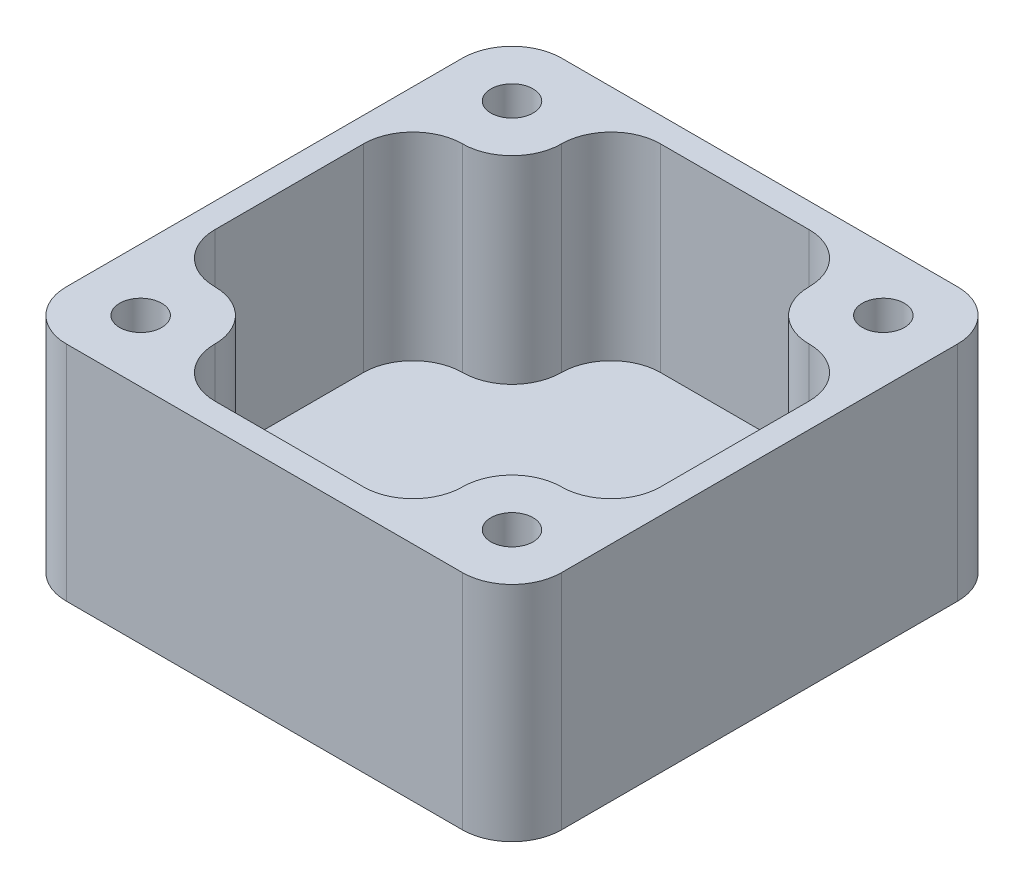
ISO-10303-21;
HEADER;
FILE_DESCRIPTION(('STEP AP214'),'2;1');
FILE_NAME('part.step','',(''),(''),'','','');
FILE_SCHEMA(('AUTOMOTIVE_DESIGN { 1 0 10303 214 1 1 1 1 }'));
ENDSEC;
DATA;
#1=APPLICATION_CONTEXT('core data for automotive mechanical design processes');
#2=APPLICATION_PROTOCOL_DEFINITION('international standard','automotive_design',2000,#1);
#3=PRODUCT_CONTEXT('',#1,'mechanical');
#4=PRODUCT('Part','Part','',(#3));
#5=PRODUCT_RELATED_PRODUCT_CATEGORY('part','',(#4));
#6=PRODUCT_DEFINITION_FORMATION('','',#4);
#7=PRODUCT_DEFINITION_CONTEXT('part definition',#1,'design');
#8=PRODUCT_DEFINITION('design','',#6,#7);
#9=PRODUCT_DEFINITION_SHAPE('','',#8);
#10=(LENGTH_UNIT() NAMED_UNIT(*) SI_UNIT(.MILLI.,.METRE.));
#11=(NAMED_UNIT(*) PLANE_ANGLE_UNIT() SI_UNIT($,.RADIAN.));
#12=(NAMED_UNIT(*) SI_UNIT($,.STERADIAN.) SOLID_ANGLE_UNIT());
#13=UNCERTAINTY_MEASURE_WITH_UNIT(LENGTH_MEASURE(1.E-05),#10,'distance_accuracy_value','');
#14=(GEOMETRIC_REPRESENTATION_CONTEXT(3) GLOBAL_UNCERTAINTY_ASSIGNED_CONTEXT((#13)) GLOBAL_UNIT_ASSIGNED_CONTEXT((#10,
#11,#12)) REPRESENTATION_CONTEXT('',''));
#15=CARTESIAN_POINT('',(0.,0.,0.));
#16=DIRECTION('',(0.,0.,1.));
#17=DIRECTION('',(1.,0.,0.));
#18=AXIS2_PLACEMENT_3D('',#15,#16,#17);
#19=CARTESIAN_POINT('',(-20.,18.,-20.));
#20=DIRECTION('',(1.,0.,0.));
#21=DIRECTION('',(0.,0.,-1.));
#22=AXIS2_PLACEMENT_3D('',#19,#20,#21);
#23=PLANE('',#22);
#24=DIRECTION('',(0.,0.,1.));
#25=VECTOR('',#24,1.);
#26=CARTESIAN_POINT('',(-20.,18.,-20.));
#27=LINE('',#26,#25);
#28=CARTESIAN_POINT('',(-20.,18.,-16.));
#29=VERTEX_POINT('',#28);
#30=CARTESIAN_POINT('',(-20.,18.,16.));
#31=VERTEX_POINT('',#30);
#32=EDGE_CURVE('E225',#29,#31,#27,.T.);
#33=ORIENTED_EDGE('',*,*,#32,.F.);
#34=DIRECTION('',(0.,-1.,0.));
#35=VECTOR('',#34,1.);
#36=CARTESIAN_POINT('',(-20.,18.,-16.));
#37=LINE('',#36,#35);
#38=CARTESIAN_POINT('',(-20.,0.,-16.));
#39=VERTEX_POINT('',#38);
#40=EDGE_CURVE('E261',#29,#39,#37,.T.);
#41=ORIENTED_EDGE('',*,*,#40,.T.);
#42=DIRECTION('',(0.,0.,1.));
#43=VECTOR('',#42,1.);
#44=CARTESIAN_POINT('',(-20.,0.,-20.));
#45=LINE('',#44,#43);
#46=CARTESIAN_POINT('',(-20.,0.,16.));
#47=VERTEX_POINT('',#46);
#48=EDGE_CURVE('E409',#39,#47,#45,.T.);
#49=ORIENTED_EDGE('',*,*,#48,.T.);
#50=DIRECTION('',(0.,-1.,0.));
#51=VECTOR('',#50,1.);
#52=CARTESIAN_POINT('',(-20.,18.,16.));
#53=LINE('',#52,#51);
#54=EDGE_CURVE('E259',#47,#31,#53,.F.);
#55=ORIENTED_EDGE('',*,*,#54,.T.);
#56=EDGE_LOOP('',(#33,#41,#49,#55));
#57=FACE_BOUND('',#56,.T.);
#58=ADVANCED_FACE('F36',(#57),#23,.F.);
#59=CARTESIAN_POINT('',(20.,18.,20.));
#60=DIRECTION('',(0.,0.,-1.));
#61=DIRECTION('',(-1.,0.,0.));
#62=AXIS2_PLACEMENT_3D('',#59,#60,#61);
#63=PLANE('',#62);
#64=DIRECTION('',(1.,0.,0.));
#65=VECTOR('',#64,1.);
#66=CARTESIAN_POINT('',(20.,18.,20.));
#67=LINE('',#66,#65);
#68=CARTESIAN_POINT('',(-16.,18.,20.));
#69=VERTEX_POINT('',#68);
#70=CARTESIAN_POINT('',(16.,18.,20.));
#71=VERTEX_POINT('',#70);
#72=EDGE_CURVE('E229',#69,#71,#67,.T.);
#73=ORIENTED_EDGE('',*,*,#72,.F.);
#74=DIRECTION('',(0.,-1.,0.));
#75=VECTOR('',#74,1.);
#76=CARTESIAN_POINT('',(-16.,18.,20.));
#77=LINE('',#76,#75);
#78=CARTESIAN_POINT('',(-16.,0.,20.));
#79=VERTEX_POINT('',#78);
#80=EDGE_CURVE('E266',#69,#79,#77,.T.);
#81=ORIENTED_EDGE('',*,*,#80,.T.);
#82=DIRECTION('',(1.,0.,0.));
#83=VECTOR('',#82,1.);
#84=CARTESIAN_POINT('',(20.,0.,20.));
#85=LINE('',#84,#83);
#86=CARTESIAN_POINT('',(16.,0.,20.));
#87=VERTEX_POINT('',#86);
#88=EDGE_CURVE('E231',#79,#87,#85,.T.);
#89=ORIENTED_EDGE('',*,*,#88,.T.);
#90=DIRECTION('',(0.,-1.,0.));
#91=VECTOR('',#90,1.);
#92=CARTESIAN_POINT('',(16.,18.,20.));
#93=LINE('',#92,#91);
#94=EDGE_CURVE('E264',#87,#71,#93,.F.);
#95=ORIENTED_EDGE('',*,*,#94,.T.);
#96=EDGE_LOOP('',(#73,#81,#89,#95));
#97=FACE_BOUND('',#96,.T.);
#98=ADVANCED_FACE('F424',(#97),#63,.F.);
#99=CARTESIAN_POINT('',(20.,18.,-20.));
#100=DIRECTION('',(-1.,0.,0.));
#101=DIRECTION('',(0.,0.,1.));
#102=AXIS2_PLACEMENT_3D('',#99,#100,#101);
#103=PLANE('',#102);
#104=DIRECTION('',(0.,0.,-1.));
#105=VECTOR('',#104,1.);
#106=CARTESIAN_POINT('',(20.,0.,-20.));
#107=LINE('',#106,#105);
#108=CARTESIAN_POINT('',(20.,0.,16.));
#109=VERTEX_POINT('',#108);
#110=CARTESIAN_POINT('',(20.,0.,-16.));
#111=VERTEX_POINT('',#110);
#112=EDGE_CURVE('E226',#109,#111,#107,.T.);
#113=ORIENTED_EDGE('',*,*,#112,.T.);
#114=DIRECTION('',(0.,-1.,0.));
#115=VECTOR('',#114,1.);
#116=CARTESIAN_POINT('',(20.,18.,-16.));
#117=LINE('',#116,#115);
#118=CARTESIAN_POINT('',(20.,18.,-16.));
#119=VERTEX_POINT('',#118);
#120=EDGE_CURVE('E204',#111,#119,#117,.F.);
#121=ORIENTED_EDGE('',*,*,#120,.T.);
#122=DIRECTION('',(0.,0.,-1.));
#123=VECTOR('',#122,1.);
#124=CARTESIAN_POINT('',(20.,18.,-20.));
#125=LINE('',#124,#123);
#126=CARTESIAN_POINT('',(20.,18.,16.));
#127=VERTEX_POINT('',#126);
#128=EDGE_CURVE('E414',#127,#119,#125,.T.);
#129=ORIENTED_EDGE('',*,*,#128,.F.);
#130=DIRECTION('',(0.,-1.,0.));
#131=VECTOR('',#130,1.);
#132=CARTESIAN_POINT('',(20.,18.,16.));
#133=LINE('',#132,#131);
#134=EDGE_CURVE('E209',#127,#109,#133,.T.);
#135=ORIENTED_EDGE('',*,*,#134,.T.);
#136=EDGE_LOOP('',(#113,#121,#129,#135));
#137=FACE_BOUND('',#136,.T.);
#138=ADVANCED_FACE('F433',(#137),#103,.F.);
#139=CARTESIAN_POINT('',(20.,18.,-20.));
#140=DIRECTION('',(0.,0.,1.));
#141=DIRECTION('',(1.,0.,0.));
#142=AXIS2_PLACEMENT_3D('',#139,#140,#141);
#143=PLANE('',#142);
#144=DIRECTION('',(-1.,0.,0.));
#145=VECTOR('',#144,1.);
#146=CARTESIAN_POINT('',(20.,18.,-20.));
#147=LINE('',#146,#145);
#148=CARTESIAN_POINT('',(16.,18.,-20.));
#149=VERTEX_POINT('',#148);
#150=CARTESIAN_POINT('',(-16.,18.,-20.));
#151=VERTEX_POINT('',#150);
#152=EDGE_CURVE('E219',#149,#151,#147,.T.);
#153=ORIENTED_EDGE('',*,*,#152,.F.);
#154=DIRECTION('',(0.,-1.,0.));
#155=VECTOR('',#154,1.);
#156=CARTESIAN_POINT('',(16.,18.,-20.));
#157=LINE('',#156,#155);
#158=CARTESIAN_POINT('',(16.,0.,-20.));
#159=VERTEX_POINT('',#158);
#160=EDGE_CURVE('E203',#149,#159,#157,.T.);
#161=ORIENTED_EDGE('',*,*,#160,.T.);
#162=DIRECTION('',(-1.,0.,0.));
#163=VECTOR('',#162,1.);
#164=CARTESIAN_POINT('',(20.,0.,-20.));
#165=LINE('',#164,#163);
#166=CARTESIAN_POINT('',(-16.,0.,-20.));
#167=VERTEX_POINT('',#166);
#168=EDGE_CURVE('E216',#159,#167,#165,.T.);
#169=ORIENTED_EDGE('',*,*,#168,.T.);
#170=DIRECTION('',(0.,-1.,0.));
#171=VECTOR('',#170,1.);
#172=CARTESIAN_POINT('',(-16.,18.,-20.));
#173=LINE('',#172,#171);
#174=EDGE_CURVE('E221',#167,#151,#173,.F.);
#175=ORIENTED_EDGE('',*,*,#174,.T.);
#176=EDGE_LOOP('',(#153,#161,#169,#175));
#177=FACE_BOUND('',#176,.T.);
#178=ADVANCED_FACE('F215',(#177),#143,.F.);
#179=CARTESIAN_POINT('',(0.,18.,0.));
#180=DIRECTION('',(0.,-1.,0.));
#181=DIRECTION('',(0.,0.,-1.));
#182=AXIS2_PLACEMENT_3D('',#179,#180,#181);
#183=PLANE('',#182);
#184=DIRECTION('',(1.,0.,0.));
#185=VECTOR('',#184,1.);
#186=CARTESIAN_POINT('',(-10.0000000000001,18.,18.));
#187=LINE('',#186,#185);
#188=CARTESIAN_POINT('',(-6.00000000000006,18.,18.));
#189=VERTEX_POINT('',#188);
#190=CARTESIAN_POINT('',(5.99999999999994,18.,18.));
#191=VERTEX_POINT('',#190);
#192=EDGE_CURVE('E331',#189,#191,#187,.T.);
#193=ORIENTED_EDGE('',*,*,#192,.F.);
#194=CARTESIAN_POINT('',(-6.00000000000005,18.,14.));
#195=DIRECTION('',(0.,-1.,0.));
#196=DIRECTION('',(0.,0.,-1.));
#197=AXIS2_PLACEMENT_3D('',#194,#195,#196);
#198=CIRCLE('',#197,4.);
#199=CARTESIAN_POINT('',(-10.,18.,14.));
#200=VERTEX_POINT('',#199);
#201=EDGE_CURVE('E303',#189,#200,#198,.T.);
#202=ORIENTED_EDGE('',*,*,#201,.T.);
#203=CARTESIAN_POINT('',(-14.,18.,14.));
#204=DIRECTION('',(0.,-1.,0.));
#205=DIRECTION('',(0.,0.,-1.));
#206=AXIS2_PLACEMENT_3D('',#203,#204,#205);
#207=CIRCLE('',#206,4.);
#208=CARTESIAN_POINT('',(-14.,18.,9.99999999999999));
#209=VERTEX_POINT('',#208);
#210=EDGE_CURVE('E249',#200,#209,#207,.F.);
#211=ORIENTED_EDGE('',*,*,#210,.T.);
#212=CARTESIAN_POINT('',(-14.,18.,5.99999999999999));
#213=DIRECTION('',(0.,-1.,0.));
#214=DIRECTION('',(0.,0.,-1.));
#215=AXIS2_PLACEMENT_3D('',#212,#213,#214);
#216=CIRCLE('',#215,4.);
#217=CARTESIAN_POINT('',(-18.,18.,5.99999999999999));
#218=VERTEX_POINT('',#217);
#219=EDGE_CURVE('E307',#209,#218,#216,.T.);
#220=ORIENTED_EDGE('',*,*,#219,.T.);
#221=DIRECTION('',(0.,0.,1.));
#222=VECTOR('',#221,1.);
#223=CARTESIAN_POINT('',(-18.,18.,9.99999999999999));
#224=LINE('',#223,#222);
#225=CARTESIAN_POINT('',(-18.,18.,-6.));
#226=VERTEX_POINT('',#225);
#227=EDGE_CURVE('E378',#226,#218,#224,.T.);
#228=ORIENTED_EDGE('',*,*,#227,.F.);
#229=CARTESIAN_POINT('',(-14.,18.,-6.));
#230=DIRECTION('',(0.,-1.,0.));
#231=DIRECTION('',(0.,0.,-1.));
#232=AXIS2_PLACEMENT_3D('',#229,#230,#231);
#233=CIRCLE('',#232,4.);
#234=CARTESIAN_POINT('',(-13.9999999999999,18.,-10.));
#235=VERTEX_POINT('',#234);
#236=EDGE_CURVE('E309',#226,#235,#233,.T.);
#237=ORIENTED_EDGE('',*,*,#236,.T.);
#238=CARTESIAN_POINT('',(-13.9999999999999,18.,-14.));
#239=DIRECTION('',(0.,-1.,0.));
#240=DIRECTION('',(0.,0.,-1.));
#241=AXIS2_PLACEMENT_3D('',#238,#239,#240);
#242=CIRCLE('',#241,4.);
#243=CARTESIAN_POINT('',(-9.99999999999995,18.,-14.));
#244=VERTEX_POINT('',#243);
#245=EDGE_CURVE('E247',#235,#244,#242,.F.);
#246=ORIENTED_EDGE('',*,*,#245,.T.);
#247=CARTESIAN_POINT('',(-5.99999999999995,18.,-14.));
#248=DIRECTION('',(0.,-1.,0.));
#249=DIRECTION('',(0.,0.,-1.));
#250=AXIS2_PLACEMENT_3D('',#247,#248,#249);
#251=CIRCLE('',#250,4.);
#252=CARTESIAN_POINT('',(-5.99999999999993,18.,-18.));
#253=VERTEX_POINT('',#252);
#254=EDGE_CURVE('E313',#244,#253,#251,.T.);
#255=ORIENTED_EDGE('',*,*,#254,.T.);
#256=DIRECTION('',(-1.,0.,0.));
#257=VECTOR('',#256,1.);
#258=CARTESIAN_POINT('',(-9.99999999999993,18.,-18.));
#259=LINE('',#258,#257);
#260=CARTESIAN_POINT('',(6.00000000000006,18.,-18.));
#261=VERTEX_POINT('',#260);
#262=EDGE_CURVE('E367',#261,#253,#259,.T.);
#263=ORIENTED_EDGE('',*,*,#262,.F.);
#264=CARTESIAN_POINT('',(6.00000000000004,18.,-14.));
#265=DIRECTION('',(0.,-1.,0.));
#266=DIRECTION('',(0.,0.,-1.));
#267=AXIS2_PLACEMENT_3D('',#264,#265,#266);
#268=CIRCLE('',#267,4.);
#269=CARTESIAN_POINT('',(10.,18.,-14.));
#270=VERTEX_POINT('',#269);
#271=EDGE_CURVE('E315',#261,#270,#268,.T.);
#272=ORIENTED_EDGE('',*,*,#271,.T.);
#273=CARTESIAN_POINT('',(14.,18.,-14.));
#274=DIRECTION('',(0.,-1.,0.));
#275=DIRECTION('',(0.,0.,-1.));
#276=AXIS2_PLACEMENT_3D('',#273,#274,#275);
#277=CIRCLE('',#276,4.);
#278=CARTESIAN_POINT('',(14.,18.,-10.));
#279=VERTEX_POINT('',#278);
#280=EDGE_CURVE('E245',#270,#279,#277,.F.);
#281=ORIENTED_EDGE('',*,*,#280,.T.);
#282=CARTESIAN_POINT('',(14.,18.,-6.));
#283=DIRECTION('',(0.,-1.,0.));
#284=DIRECTION('',(0.,0.,-1.));
#285=AXIS2_PLACEMENT_3D('',#282,#283,#284);
#286=CIRCLE('',#285,4.);
#287=CARTESIAN_POINT('',(18.,18.,-6.));
#288=VERTEX_POINT('',#287);
#289=EDGE_CURVE('E319',#279,#288,#286,.T.);
#290=ORIENTED_EDGE('',*,*,#289,.T.);
#291=DIRECTION('',(0.,0.,-1.));
#292=VECTOR('',#291,1.);
#293=CARTESIAN_POINT('',(18.,18.,9.99999999999999));
#294=LINE('',#293,#292);
#295=CARTESIAN_POINT('',(18.,18.,5.99999999999999));
#296=VERTEX_POINT('',#295);
#297=EDGE_CURVE('E375',#296,#288,#294,.T.);
#298=ORIENTED_EDGE('',*,*,#297,.F.);
#299=CARTESIAN_POINT('',(14.,18.,5.99999999999999));
#300=DIRECTION('',(0.,-1.,0.));
#301=DIRECTION('',(0.,0.,-1.));
#302=AXIS2_PLACEMENT_3D('',#299,#300,#301);
#303=CIRCLE('',#302,4.);
#304=CARTESIAN_POINT('',(14.,18.,9.99999999999999));
#305=VERTEX_POINT('',#304);
#306=EDGE_CURVE('E321',#296,#305,#303,.T.);
#307=ORIENTED_EDGE('',*,*,#306,.T.);
#308=CARTESIAN_POINT('',(14.,18.,14.));
#309=DIRECTION('',(0.,-1.,0.));
#310=DIRECTION('',(0.,0.,-1.));
#311=AXIS2_PLACEMENT_3D('',#308,#309,#310);
#312=CIRCLE('',#311,4.);
#313=CARTESIAN_POINT('',(9.99999999999995,18.,14.));
#314=VERTEX_POINT('',#313);
#315=EDGE_CURVE('E243',#305,#314,#312,.F.);
#316=ORIENTED_EDGE('',*,*,#315,.T.);
#317=CARTESIAN_POINT('',(5.99999999999995,18.,14.));
#318=DIRECTION('',(0.,-1.,0.));
#319=DIRECTION('',(0.,0.,-1.));
#320=AXIS2_PLACEMENT_3D('',#317,#318,#319);
#321=CIRCLE('',#320,4.);
#322=EDGE_CURVE('E45',#314,#191,#321,.T.);
#323=ORIENTED_EDGE('',*,*,#322,.T.);
#324=EDGE_LOOP('',(#193,#202,#211,#220,#228,#237,#246,#255,#263,#272,#281,#290,#298,#307,#316,#323));
#325=FACE_BOUND('',#324,.T.);
#326=CARTESIAN_POINT('',(-15.,18.,-15.));
#327=DIRECTION('',(0.,1.,0.));
#328=DIRECTION('',(0.,0.,1.));
#329=AXIS2_PLACEMENT_3D('',#326,#327,#328);
#330=CIRCLE('',#329,1.7);
#331=CARTESIAN_POINT('',(-15.,18.,-13.3));
#332=VERTEX_POINT('',#331);
#333=EDGE_CURVE('E386',#332,#332,#330,.T.);
#334=ORIENTED_EDGE('',*,*,#333,.F.);
#335=EDGE_LOOP('',(#334));
#336=FACE_BOUND('',#335,.T.);
#337=CARTESIAN_POINT('',(-15.,18.,15.));
#338=DIRECTION('',(0.,1.,0.));
#339=DIRECTION('',(0.,0.,1.));
#340=AXIS2_PLACEMENT_3D('',#337,#338,#339);
#341=CIRCLE('',#340,1.7);
#342=CARTESIAN_POINT('',(-15.,18.,16.7));
#343=VERTEX_POINT('',#342);
#344=EDGE_CURVE('E398',#343,#343,#341,.T.);
#345=ORIENTED_EDGE('',*,*,#344,.F.);
#346=EDGE_LOOP('',(#345));
#347=FACE_BOUND('',#346,.T.);
#348=CARTESIAN_POINT('',(15.,18.,15.));
#349=DIRECTION('',(0.,1.,0.));
#350=DIRECTION('',(0.,0.,1.));
#351=AXIS2_PLACEMENT_3D('',#348,#349,#350);
#352=CIRCLE('',#351,1.7);
#353=CARTESIAN_POINT('',(15.,18.,16.7));
#354=VERTEX_POINT('',#353);
#355=EDGE_CURVE('E392',#354,#354,#352,.T.);
#356=ORIENTED_EDGE('',*,*,#355,.F.);
#357=EDGE_LOOP('',(#356));
#358=FACE_BOUND('',#357,.T.);
#359=CARTESIAN_POINT('',(15.,18.,-15.));
#360=DIRECTION('',(0.,1.,0.));
#361=DIRECTION('',(0.,0.,1.));
#362=AXIS2_PLACEMENT_3D('',#359,#360,#361);
#363=CIRCLE('',#362,1.7);
#364=CARTESIAN_POINT('',(15.,18.,-13.3));
#365=VERTEX_POINT('',#364);
#366=EDGE_CURVE('E391',#365,#365,#363,.T.);
#367=ORIENTED_EDGE('',*,*,#366,.F.);
#368=EDGE_LOOP('',(#367));
#369=FACE_BOUND('',#368,.T.);
#370=ORIENTED_EDGE('',*,*,#128,.T.);
#371=CARTESIAN_POINT('',(16.,18.,-16.));
#372=DIRECTION('',(0.,-1.,0.));
#373=DIRECTION('',(0.,0.,-1.));
#374=AXIS2_PLACEMENT_3D('',#371,#372,#373);
#375=CIRCLE('',#374,4.);
#376=EDGE_CURVE('E257',#119,#149,#375,.F.);
#377=ORIENTED_EDGE('',*,*,#376,.T.);
#378=ORIENTED_EDGE('',*,*,#152,.T.);
#379=CARTESIAN_POINT('',(-16.,18.,-16.));
#380=DIRECTION('',(0.,-1.,0.));
#381=DIRECTION('',(0.,0.,-1.));
#382=AXIS2_PLACEMENT_3D('',#379,#380,#381);
#383=CIRCLE('',#382,4.);
#384=EDGE_CURVE('E255',#151,#29,#383,.F.);
#385=ORIENTED_EDGE('',*,*,#384,.T.);
#386=ORIENTED_EDGE('',*,*,#32,.T.);
#387=CARTESIAN_POINT('',(-16.,18.,16.));
#388=DIRECTION('',(0.,-1.,0.));
#389=DIRECTION('',(0.,0.,-1.));
#390=AXIS2_PLACEMENT_3D('',#387,#388,#389);
#391=CIRCLE('',#390,4.);
#392=EDGE_CURVE('E253',#31,#69,#391,.F.);
#393=ORIENTED_EDGE('',*,*,#392,.T.);
#394=ORIENTED_EDGE('',*,*,#72,.T.);
#395=CARTESIAN_POINT('',(16.,18.,16.));
#396=DIRECTION('',(0.,-1.,0.));
#397=DIRECTION('',(0.,0.,-1.));
#398=AXIS2_PLACEMENT_3D('',#395,#396,#397);
#399=CIRCLE('',#398,4.);
#400=EDGE_CURVE('E251',#71,#127,#399,.F.);
#401=ORIENTED_EDGE('',*,*,#400,.T.);
#402=EDGE_LOOP('',(#370,#377,#378,#385,#386,#393,#394,#401));
#403=FACE_BOUND('',#402,.T.);
#404=ADVANCED_FACE('F360',(#325,#336,#347,#358,#369,#403),#183,.F.);
#405=CARTESIAN_POINT('',(0.,0.,0.));
#406=DIRECTION('',(0.,-1.,0.));
#407=DIRECTION('',(0.,0.,-1.));
#408=AXIS2_PLACEMENT_3D('',#405,#406,#407);
#409=PLANE('',#408);
#410=CARTESIAN_POINT('',(-15.,0.,-15.));
#411=DIRECTION('',(0.,1.,0.));
#412=DIRECTION('',(0.,0.,1.));
#413=AXIS2_PLACEMENT_3D('',#410,#411,#412);
#414=CIRCLE('',#413,1.7);
#415=CARTESIAN_POINT('',(-15.,0.,-13.3));
#416=VERTEX_POINT('',#415);
#417=EDGE_CURVE('E401',#416,#416,#414,.T.);
#418=ORIENTED_EDGE('',*,*,#417,.T.);
#419=EDGE_LOOP('',(#418));
#420=FACE_BOUND('',#419,.T.);
#421=CARTESIAN_POINT('',(-15.,0.,15.));
#422=DIRECTION('',(0.,1.,0.));
#423=DIRECTION('',(0.,0.,1.));
#424=AXIS2_PLACEMENT_3D('',#421,#422,#423);
#425=CIRCLE('',#424,1.7);
#426=CARTESIAN_POINT('',(-15.,0.,16.7));
#427=VERTEX_POINT('',#426);
#428=EDGE_CURVE('E395',#427,#427,#425,.T.);
#429=ORIENTED_EDGE('',*,*,#428,.T.);
#430=EDGE_LOOP('',(#429));
#431=FACE_BOUND('',#430,.T.);
#432=CARTESIAN_POINT('',(15.,0.,15.));
#433=DIRECTION('',(0.,1.,0.));
#434=DIRECTION('',(0.,0.,1.));
#435=AXIS2_PLACEMENT_3D('',#432,#433,#434);
#436=CIRCLE('',#435,1.7);
#437=CARTESIAN_POINT('',(15.,0.,16.7));
#438=VERTEX_POINT('',#437);
#439=EDGE_CURVE('E388',#438,#438,#436,.T.);
#440=ORIENTED_EDGE('',*,*,#439,.T.);
#441=EDGE_LOOP('',(#440));
#442=FACE_BOUND('',#441,.T.);
#443=CARTESIAN_POINT('',(15.,0.,-15.));
#444=DIRECTION('',(0.,1.,0.));
#445=DIRECTION('',(0.,0.,1.));
#446=AXIS2_PLACEMENT_3D('',#443,#444,#445);
#447=CIRCLE('',#446,1.7);
#448=CARTESIAN_POINT('',(15.,0.,-13.3));
#449=VERTEX_POINT('',#448);
#450=EDGE_CURVE('E406',#449,#449,#447,.T.);
#451=ORIENTED_EDGE('',*,*,#450,.T.);
#452=EDGE_LOOP('',(#451));
#453=FACE_BOUND('',#452,.T.);
#454=ORIENTED_EDGE('',*,*,#168,.F.);
#455=CARTESIAN_POINT('',(16.,0.,-16.));
#456=DIRECTION('',(0.,-1.,0.));
#457=DIRECTION('',(0.,0.,-1.));
#458=AXIS2_PLACEMENT_3D('',#455,#456,#457);
#459=CIRCLE('',#458,4.);
#460=EDGE_CURVE('E199',#159,#111,#459,.T.);
#461=ORIENTED_EDGE('',*,*,#460,.T.);
#462=ORIENTED_EDGE('',*,*,#112,.F.);
#463=CARTESIAN_POINT('',(16.,0.,16.));
#464=DIRECTION('',(0.,-1.,0.));
#465=DIRECTION('',(0.,0.,-1.));
#466=AXIS2_PLACEMENT_3D('',#463,#464,#465);
#467=CIRCLE('',#466,4.);
#468=EDGE_CURVE('E220',#109,#87,#467,.T.);
#469=ORIENTED_EDGE('',*,*,#468,.T.);
#470=ORIENTED_EDGE('',*,*,#88,.F.);
#471=CARTESIAN_POINT('',(-16.,0.,16.));
#472=DIRECTION('',(0.,-1.,0.));
#473=DIRECTION('',(0.,0.,-1.));
#474=AXIS2_PLACEMENT_3D('',#471,#472,#473);
#475=CIRCLE('',#474,4.);
#476=EDGE_CURVE('E237',#79,#47,#475,.T.);
#477=ORIENTED_EDGE('',*,*,#476,.T.);
#478=ORIENTED_EDGE('',*,*,#48,.F.);
#479=CARTESIAN_POINT('',(-16.,0.,-16.));
#480=DIRECTION('',(0.,-1.,0.));
#481=DIRECTION('',(0.,0.,-1.));
#482=AXIS2_PLACEMENT_3D('',#479,#480,#481);
#483=CIRCLE('',#482,4.);
#484=EDGE_CURVE('E210',#39,#167,#483,.T.);
#485=ORIENTED_EDGE('',*,*,#484,.T.);
#486=EDGE_LOOP('',(#454,#461,#462,#469,#470,#477,#478,#485));
#487=FACE_BOUND('',#486,.T.);
#488=ADVANCED_FACE('F223',(#420,#431,#442,#453,#487),#409,.T.);
#489=CARTESIAN_POINT('',(15.,0.,-15.));
#490=DIRECTION('',(0.,1.,0.));
#491=DIRECTION('',(0.,0.,1.));
#492=AXIS2_PLACEMENT_3D('',#489,#490,#491);
#493=CYLINDRICAL_SURFACE('',#492,1.7);
#494=ORIENTED_EDGE('',*,*,#450,.F.);
#495=EDGE_LOOP('',(#494));
#496=FACE_BOUND('',#495,.T.);
#497=ORIENTED_EDGE('',*,*,#366,.T.);
#498=EDGE_LOOP('',(#497));
#499=FACE_BOUND('',#498,.T.);
#500=ADVANCED_FACE('F617',(#496,#499),#493,.F.);
#501=CARTESIAN_POINT('',(15.,0.,15.));
#502=DIRECTION('',(0.,1.,0.));
#503=DIRECTION('',(0.,0.,1.));
#504=AXIS2_PLACEMENT_3D('',#501,#502,#503);
#505=CYLINDRICAL_SURFACE('',#504,1.7);
#506=ORIENTED_EDGE('',*,*,#439,.F.);
#507=EDGE_LOOP('',(#506));
#508=FACE_BOUND('',#507,.T.);
#509=ORIENTED_EDGE('',*,*,#355,.T.);
#510=EDGE_LOOP('',(#509));
#511=FACE_BOUND('',#510,.T.);
#512=ADVANCED_FACE('F609',(#508,#511),#505,.F.);
#513=CARTESIAN_POINT('',(-15.,0.,15.));
#514=DIRECTION('',(0.,1.,0.));
#515=DIRECTION('',(0.,0.,1.));
#516=AXIS2_PLACEMENT_3D('',#513,#514,#515);
#517=CYLINDRICAL_SURFACE('',#516,1.7);
#518=ORIENTED_EDGE('',*,*,#428,.F.);
#519=EDGE_LOOP('',(#518));
#520=FACE_BOUND('',#519,.T.);
#521=ORIENTED_EDGE('',*,*,#344,.T.);
#522=EDGE_LOOP('',(#521));
#523=FACE_BOUND('',#522,.T.);
#524=ADVANCED_FACE('F601',(#520,#523),#517,.F.);
#525=CARTESIAN_POINT('',(-15.,0.,-15.));
#526=DIRECTION('',(0.,1.,0.));
#527=DIRECTION('',(0.,0.,1.));
#528=AXIS2_PLACEMENT_3D('',#525,#526,#527);
#529=CYLINDRICAL_SURFACE('',#528,1.7);
#530=ORIENTED_EDGE('',*,*,#417,.F.);
#531=EDGE_LOOP('',(#530));
#532=FACE_BOUND('',#531,.T.);
#533=ORIENTED_EDGE('',*,*,#333,.T.);
#534=EDGE_LOOP('',(#533));
#535=FACE_BOUND('',#534,.T.);
#536=ADVANCED_FACE('F593',(#532,#535),#529,.F.);
#537=CARTESIAN_POINT('',(0.,2.,0.));
#538=DIRECTION('',(0.,-1.,0.));
#539=DIRECTION('',(0.,0.,-1.));
#540=AXIS2_PLACEMENT_3D('',#537,#538,#539);
#541=PLANE('',#540);
#542=CARTESIAN_POINT('',(-14.,2.,5.99999999999999));
#543=DIRECTION('',(0.,-1.,0.));
#544=DIRECTION('',(0.,0.,-1.));
#545=AXIS2_PLACEMENT_3D('',#542,#543,#544);
#546=CIRCLE('',#545,4.);
#547=CARTESIAN_POINT('',(-18.,2.,5.99999999999999));
#548=VERTEX_POINT('',#547);
#549=CARTESIAN_POINT('',(-14.,2.,9.99999999999999));
#550=VERTEX_POINT('',#549);
#551=EDGE_CURVE('E285',#548,#550,#546,.F.);
#552=ORIENTED_EDGE('',*,*,#551,.T.);
#553=CARTESIAN_POINT('',(-14.,2.,14.));
#554=DIRECTION('',(0.,-1.,0.));
#555=DIRECTION('',(0.,0.,-1.));
#556=AXIS2_PLACEMENT_3D('',#553,#554,#555);
#557=CIRCLE('',#556,4.);
#558=CARTESIAN_POINT('',(-10.,2.,14.));
#559=VERTEX_POINT('',#558);
#560=EDGE_CURVE('E305',#550,#559,#557,.T.);
#561=ORIENTED_EDGE('',*,*,#560,.T.);
#562=CARTESIAN_POINT('',(-6.00000000000005,2.,14.));
#563=DIRECTION('',(0.,-1.,0.));
#564=DIRECTION('',(0.,0.,-1.));
#565=AXIS2_PLACEMENT_3D('',#562,#563,#564);
#566=CIRCLE('',#565,4.);
#567=CARTESIAN_POINT('',(-6.00000000000006,2.,18.));
#568=VERTEX_POINT('',#567);
#569=EDGE_CURVE('E287',#559,#568,#566,.F.);
#570=ORIENTED_EDGE('',*,*,#569,.T.);
#571=DIRECTION('',(1.,0.,0.));
#572=VECTOR('',#571,1.);
#573=CARTESIAN_POINT('',(-10.0000000000001,2.,18.));
#574=LINE('',#573,#572);
#575=CARTESIAN_POINT('',(5.99999999999994,2.,18.));
#576=VERTEX_POINT('',#575);
#577=EDGE_CURVE('E373',#568,#576,#574,.T.);
#578=ORIENTED_EDGE('',*,*,#577,.T.);
#579=CARTESIAN_POINT('',(5.99999999999995,2.,14.));
#580=DIRECTION('',(0.,-1.,0.));
#581=DIRECTION('',(0.,0.,-1.));
#582=AXIS2_PLACEMENT_3D('',#579,#580,#581);
#583=CIRCLE('',#582,4.);
#584=CARTESIAN_POINT('',(9.99999999999995,2.,14.));
#585=VERTEX_POINT('',#584);
#586=EDGE_CURVE('E274',#576,#585,#583,.F.);
#587=ORIENTED_EDGE('',*,*,#586,.T.);
#588=CARTESIAN_POINT('',(14.,2.,14.));
#589=DIRECTION('',(0.,-1.,0.));
#590=DIRECTION('',(0.,0.,-1.));
#591=AXIS2_PLACEMENT_3D('',#588,#589,#590);
#592=CIRCLE('',#591,4.);
#593=CARTESIAN_POINT('',(14.,2.,9.99999999999999));
#594=VERTEX_POINT('',#593);
#595=EDGE_CURVE('E12',#585,#594,#592,.T.);
#596=ORIENTED_EDGE('',*,*,#595,.T.);
#597=CARTESIAN_POINT('',(14.,2.,5.99999999999999));
#598=DIRECTION('',(0.,-1.,0.));
#599=DIRECTION('',(0.,0.,-1.));
#600=AXIS2_PLACEMENT_3D('',#597,#598,#599);
#601=CIRCLE('',#600,4.);
#602=CARTESIAN_POINT('',(18.,2.,5.99999999999999));
#603=VERTEX_POINT('',#602);
#604=EDGE_CURVE('E276',#594,#603,#601,.F.);
#605=ORIENTED_EDGE('',*,*,#604,.T.);
#606=DIRECTION('',(0.,0.,-1.));
#607=VECTOR('',#606,1.);
#608=CARTESIAN_POINT('',(18.,2.,9.99999999999999));
#609=LINE('',#608,#607);
#610=CARTESIAN_POINT('',(18.,2.,-6.));
#611=VERTEX_POINT('',#610);
#612=EDGE_CURVE('E383',#603,#611,#609,.T.);
#613=ORIENTED_EDGE('',*,*,#612,.T.);
#614=CARTESIAN_POINT('',(14.,2.,-6.));
#615=DIRECTION('',(0.,-1.,0.));
#616=DIRECTION('',(0.,0.,-1.));
#617=AXIS2_PLACEMENT_3D('',#614,#615,#616);
#618=CIRCLE('',#617,4.);
#619=CARTESIAN_POINT('',(14.,2.,-10.));
#620=VERTEX_POINT('',#619);
#621=EDGE_CURVE('E278',#611,#620,#618,.F.);
#622=ORIENTED_EDGE('',*,*,#621,.T.);
#623=CARTESIAN_POINT('',(14.,2.,-14.));
#624=DIRECTION('',(0.,-1.,0.));
#625=DIRECTION('',(0.,0.,-1.));
#626=AXIS2_PLACEMENT_3D('',#623,#624,#625);
#627=CIRCLE('',#626,4.);
#628=CARTESIAN_POINT('',(10.,2.,-14.));
#629=VERTEX_POINT('',#628);
#630=EDGE_CURVE('E317',#620,#629,#627,.T.);
#631=ORIENTED_EDGE('',*,*,#630,.T.);
#632=CARTESIAN_POINT('',(6.00000000000004,2.,-14.));
#633=DIRECTION('',(0.,-1.,0.));
#634=DIRECTION('',(0.,0.,-1.));
#635=AXIS2_PLACEMENT_3D('',#632,#633,#634);
#636=CIRCLE('',#635,4.);
#637=CARTESIAN_POINT('',(6.00000000000006,2.,-18.));
#638=VERTEX_POINT('',#637);
#639=EDGE_CURVE('E280',#629,#638,#636,.F.);
#640=ORIENTED_EDGE('',*,*,#639,.T.);
#641=DIRECTION('',(-1.,0.,0.));
#642=VECTOR('',#641,1.);
#643=CARTESIAN_POINT('',(-9.99999999999993,2.,-18.));
#644=LINE('',#643,#642);
#645=CARTESIAN_POINT('',(-5.99999999999993,2.,-18.));
#646=VERTEX_POINT('',#645);
#647=EDGE_CURVE('E370',#638,#646,#644,.T.);
#648=ORIENTED_EDGE('',*,*,#647,.T.);
#649=CARTESIAN_POINT('',(-5.99999999999995,2.,-14.));
#650=DIRECTION('',(0.,-1.,0.));
#651=DIRECTION('',(0.,0.,-1.));
#652=AXIS2_PLACEMENT_3D('',#649,#650,#651);
#653=CIRCLE('',#652,4.);
#654=CARTESIAN_POINT('',(-9.99999999999995,2.,-14.));
#655=VERTEX_POINT('',#654);
#656=EDGE_CURVE('E282',#646,#655,#653,.F.);
#657=ORIENTED_EDGE('',*,*,#656,.T.);
#658=CARTESIAN_POINT('',(-13.9999999999999,2.,-14.));
#659=DIRECTION('',(0.,-1.,0.));
#660=DIRECTION('',(0.,0.,-1.));
#661=AXIS2_PLACEMENT_3D('',#658,#659,#660);
#662=CIRCLE('',#661,4.);
#663=CARTESIAN_POINT('',(-14.,2.,-10.));
#664=VERTEX_POINT('',#663);
#665=EDGE_CURVE('E311',#655,#664,#662,.T.);
#666=ORIENTED_EDGE('',*,*,#665,.T.);
#667=CARTESIAN_POINT('',(-14.,2.,-6.));
#668=DIRECTION('',(0.,-1.,0.));
#669=DIRECTION('',(0.,0.,-1.));
#670=AXIS2_PLACEMENT_3D('',#667,#668,#669);
#671=CIRCLE('',#670,4.);
#672=CARTESIAN_POINT('',(-18.,2.,-6.));
#673=VERTEX_POINT('',#672);
#674=EDGE_CURVE('E60',#664,#673,#671,.F.);
#675=ORIENTED_EDGE('',*,*,#674,.T.);
#676=DIRECTION('',(0.,0.,1.));
#677=VECTOR('',#676,1.);
#678=CARTESIAN_POINT('',(-18.,2.,9.99999999999999));
#679=LINE('',#678,#677);
#680=EDGE_CURVE('E380',#673,#548,#679,.T.);
#681=ORIENTED_EDGE('',*,*,#680,.T.);
#682=EDGE_LOOP('',(#552,#561,#570,#578,#587,#596,#605,#613,#622,#631,#640,#648,#657,#666,#675,#681));
#683=FACE_BOUND('',#682,.T.);
#684=ADVANCED_FACE('F586',(#683),#541,.F.);
#685=CARTESIAN_POINT('',(-18.,-41.182520563948,9.99999999999999));
#686=DIRECTION('',(-1.,0.,0.));
#687=DIRECTION('',(0.,0.,1.));
#688=AXIS2_PLACEMENT_3D('',#685,#686,#687);
#689=PLANE('',#688);
#690=ORIENTED_EDGE('',*,*,#227,.T.);
#691=DIRECTION('',(0.,1.,0.));
#692=VECTOR('',#691,1.);
#693=CARTESIAN_POINT('',(-18.,2.,5.99999999999999));
#694=LINE('',#693,#692);
#695=EDGE_CURVE('E53',#218,#548,#694,.F.);
#696=ORIENTED_EDGE('',*,*,#695,.T.);
#697=ORIENTED_EDGE('',*,*,#680,.F.);
#698=DIRECTION('',(0.,1.,0.));
#699=VECTOR('',#698,1.);
#700=CARTESIAN_POINT('',(-18.,18.,-6.));
#701=LINE('',#700,#699);
#702=EDGE_CURVE('E289',#673,#226,#701,.T.);
#703=ORIENTED_EDGE('',*,*,#702,.T.);
#704=EDGE_LOOP('',(#690,#696,#697,#703));
#705=FACE_BOUND('',#704,.T.);
#706=ADVANCED_FACE('F578',(#705),#689,.F.);
#707=CARTESIAN_POINT('',(18.,-41.182520563948,9.99999999999999));
#708=DIRECTION('',(1.,0.,0.));
#709=DIRECTION('',(0.,0.,-1.));
#710=AXIS2_PLACEMENT_3D('',#707,#708,#709);
#711=PLANE('',#710);
#712=ORIENTED_EDGE('',*,*,#297,.T.);
#713=DIRECTION('',(0.,1.,0.));
#714=VECTOR('',#713,1.);
#715=CARTESIAN_POINT('',(18.,2.,-6.));
#716=LINE('',#715,#714);
#717=EDGE_CURVE('E301',#288,#611,#716,.F.);
#718=ORIENTED_EDGE('',*,*,#717,.T.);
#719=ORIENTED_EDGE('',*,*,#612,.F.);
#720=DIRECTION('',(0.,1.,0.));
#721=VECTOR('',#720,1.);
#722=CARTESIAN_POINT('',(18.,18.,5.99999999999999));
#723=LINE('',#722,#721);
#724=EDGE_CURVE('E298',#603,#296,#723,.T.);
#725=ORIENTED_EDGE('',*,*,#724,.T.);
#726=EDGE_LOOP('',(#712,#718,#719,#725));
#727=FACE_BOUND('',#726,.T.);
#728=ADVANCED_FACE('F571',(#727),#711,.F.);
#729=CARTESIAN_POINT('',(-10.0000000000001,-41.1825205639481,18.));
#730=DIRECTION('',(0.,0.,1.));
#731=DIRECTION('',(1.,0.,0.));
#732=AXIS2_PLACEMENT_3D('',#729,#730,#731);
#733=PLANE('',#732);
#734=ORIENTED_EDGE('',*,*,#577,.F.);
#735=DIRECTION('',(0.,1.,0.));
#736=VECTOR('',#735,1.);
#737=CARTESIAN_POINT('',(-6.00000000000006,18.,18.));
#738=LINE('',#737,#736);
#739=EDGE_CURVE('E271',#568,#189,#738,.T.);
#740=ORIENTED_EDGE('',*,*,#739,.T.);
#741=ORIENTED_EDGE('',*,*,#192,.T.);
#742=DIRECTION('',(0.,1.,0.));
#743=VECTOR('',#742,1.);
#744=CARTESIAN_POINT('',(5.99999999999994,2.,18.));
#745=LINE('',#744,#743);
#746=EDGE_CURVE('E269',#191,#576,#745,.F.);
#747=ORIENTED_EDGE('',*,*,#746,.T.);
#748=EDGE_LOOP('',(#734,#740,#741,#747));
#749=FACE_BOUND('',#748,.T.);
#750=ADVANCED_FACE('F364',(#749),#733,.F.);
#751=CARTESIAN_POINT('',(-9.99999999999993,-41.1825205639481,-18.));
#752=DIRECTION('',(0.,0.,-1.));
#753=DIRECTION('',(-1.,0.,0.));
#754=AXIS2_PLACEMENT_3D('',#751,#752,#753);
#755=PLANE('',#754);
#756=ORIENTED_EDGE('',*,*,#262,.T.);
#757=DIRECTION('',(0.,1.,0.));
#758=VECTOR('',#757,1.);
#759=CARTESIAN_POINT('',(-5.99999999999993,2.,-18.));
#760=LINE('',#759,#758);
#761=EDGE_CURVE('E296',#253,#646,#760,.F.);
#762=ORIENTED_EDGE('',*,*,#761,.T.);
#763=ORIENTED_EDGE('',*,*,#647,.F.);
#764=DIRECTION('',(0.,1.,0.));
#765=VECTOR('',#764,1.);
#766=CARTESIAN_POINT('',(6.00000000000006,18.,-18.));
#767=LINE('',#766,#765);
#768=EDGE_CURVE('E293',#638,#261,#767,.T.);
#769=ORIENTED_EDGE('',*,*,#768,.T.);
#770=EDGE_LOOP('',(#756,#762,#763,#769));
#771=FACE_BOUND('',#770,.T.);
#772=ADVANCED_FACE('F452',(#771),#755,.F.);
#773=CARTESIAN_POINT('',(16.,18.,-16.));
#774=DIRECTION('',(0.,-1.,0.));
#775=DIRECTION('',(0.,0.,-1.));
#776=AXIS2_PLACEMENT_3D('',#773,#774,#775);
#777=CYLINDRICAL_SURFACE('',#776,4.);
#778=ORIENTED_EDGE('',*,*,#376,.F.);
#779=ORIENTED_EDGE('',*,*,#120,.F.);
#780=ORIENTED_EDGE('',*,*,#460,.F.);
#781=ORIENTED_EDGE('',*,*,#160,.F.);
#782=EDGE_LOOP('',(#778,#779,#780,#781));
#783=FACE_BOUND('',#782,.T.);
#784=ADVANCED_FACE('F202',(#783),#777,.T.);
#785=CARTESIAN_POINT('',(-16.,18.,-16.));
#786=DIRECTION('',(0.,-1.,0.));
#787=DIRECTION('',(0.,0.,-1.));
#788=AXIS2_PLACEMENT_3D('',#785,#786,#787);
#789=CYLINDRICAL_SURFACE('',#788,4.);
#790=ORIENTED_EDGE('',*,*,#384,.F.);
#791=ORIENTED_EDGE('',*,*,#174,.F.);
#792=ORIENTED_EDGE('',*,*,#484,.F.);
#793=ORIENTED_EDGE('',*,*,#40,.F.);
#794=EDGE_LOOP('',(#790,#791,#792,#793));
#795=FACE_BOUND('',#794,.T.);
#796=ADVANCED_FACE('F451',(#795),#789,.T.);
#797=CARTESIAN_POINT('',(-16.,18.,16.));
#798=DIRECTION('',(0.,-1.,0.));
#799=DIRECTION('',(0.,0.,-1.));
#800=AXIS2_PLACEMENT_3D('',#797,#798,#799);
#801=CYLINDRICAL_SURFACE('',#800,4.);
#802=ORIENTED_EDGE('',*,*,#392,.F.);
#803=ORIENTED_EDGE('',*,*,#54,.F.);
#804=ORIENTED_EDGE('',*,*,#476,.F.);
#805=ORIENTED_EDGE('',*,*,#80,.F.);
#806=EDGE_LOOP('',(#802,#803,#804,#805));
#807=FACE_BOUND('',#806,.T.);
#808=ADVANCED_FACE('F455',(#807),#801,.T.);
#809=CARTESIAN_POINT('',(16.,18.,16.));
#810=DIRECTION('',(0.,-1.,0.));
#811=DIRECTION('',(0.,0.,-1.));
#812=AXIS2_PLACEMENT_3D('',#809,#810,#811);
#813=CYLINDRICAL_SURFACE('',#812,4.);
#814=ORIENTED_EDGE('',*,*,#400,.F.);
#815=ORIENTED_EDGE('',*,*,#94,.F.);
#816=ORIENTED_EDGE('',*,*,#468,.F.);
#817=ORIENTED_EDGE('',*,*,#134,.F.);
#818=EDGE_LOOP('',(#814,#815,#816,#817));
#819=FACE_BOUND('',#818,.T.);
#820=ADVANCED_FACE('F428',(#819),#813,.T.);
#821=CARTESIAN_POINT('',(-14.,-41.182520563948,5.99999999999999));
#822=DIRECTION('',(0.,-1.,0.));
#823=DIRECTION('',(0.,0.,-1.));
#824=AXIS2_PLACEMENT_3D('',#821,#822,#823);
#825=CYLINDRICAL_SURFACE('',#824,4.);
#826=ORIENTED_EDGE('',*,*,#695,.F.);
#827=ORIENTED_EDGE('',*,*,#219,.F.);
#828=DIRECTION('',(0.,1.,0.));
#829=VECTOR('',#828,1.);
#830=CARTESIAN_POINT('',(-14.,18.,9.99999999999999));
#831=LINE('',#830,#829);
#832=EDGE_CURVE('E327',#550,#209,#831,.T.);
#833=ORIENTED_EDGE('',*,*,#832,.F.);
#834=ORIENTED_EDGE('',*,*,#551,.F.);
#835=EDGE_LOOP('',(#826,#827,#833,#834));
#836=FACE_BOUND('',#835,.T.);
#837=ADVANCED_FACE('F462',(#836),#825,.F.);
#838=CARTESIAN_POINT('',(-14.,-41.182520563948,14.));
#839=DIRECTION('',(0.,-1.,0.));
#840=DIRECTION('',(0.,0.,-1.));
#841=AXIS2_PLACEMENT_3D('',#838,#839,#840);
#842=CYLINDRICAL_SURFACE('',#841,4.);
#843=DIRECTION('',(0.,-1.,0.));
#844=VECTOR('',#843,1.);
#845=CARTESIAN_POINT('',(-10.,-41.1825205639481,14.));
#846=LINE('',#845,#844);
#847=EDGE_CURVE('E324',#559,#200,#846,.F.);
#848=ORIENTED_EDGE('',*,*,#847,.F.);
#849=ORIENTED_EDGE('',*,*,#560,.F.);
#850=ORIENTED_EDGE('',*,*,#832,.T.);
#851=ORIENTED_EDGE('',*,*,#210,.F.);
#852=EDGE_LOOP('',(#848,#849,#850,#851));
#853=FACE_BOUND('',#852,.T.);
#854=ADVANCED_FACE('F467',(#853),#842,.T.);
#855=CARTESIAN_POINT('',(-6.00000000000005,-41.1825205639481,14.));
#856=DIRECTION('',(0.,-1.,0.));
#857=DIRECTION('',(0.,0.,-1.));
#858=AXIS2_PLACEMENT_3D('',#855,#856,#857);
#859=CYLINDRICAL_SURFACE('',#858,4.);
#860=ORIENTED_EDGE('',*,*,#569,.F.);
#861=ORIENTED_EDGE('',*,*,#847,.T.);
#862=ORIENTED_EDGE('',*,*,#201,.F.);
#863=ORIENTED_EDGE('',*,*,#739,.F.);
#864=EDGE_LOOP('',(#860,#861,#862,#863));
#865=FACE_BOUND('',#864,.T.);
#866=ADVANCED_FACE('F463',(#865),#859,.F.);
#867=CARTESIAN_POINT('',(-5.99999999999995,-41.1825205639481,-14.));
#868=DIRECTION('',(0.,-1.,0.));
#869=DIRECTION('',(0.,0.,-1.));
#870=AXIS2_PLACEMENT_3D('',#867,#868,#869);
#871=CYLINDRICAL_SURFACE('',#870,4.);
#872=ORIENTED_EDGE('',*,*,#761,.F.);
#873=ORIENTED_EDGE('',*,*,#254,.F.);
#874=DIRECTION('',(0.,1.,0.));
#875=VECTOR('',#874,1.);
#876=CARTESIAN_POINT('',(-9.99999999999994,18.,-14.));
#877=LINE('',#876,#875);
#878=EDGE_CURVE('E328',#655,#244,#877,.T.);
#879=ORIENTED_EDGE('',*,*,#878,.F.);
#880=ORIENTED_EDGE('',*,*,#656,.F.);
#881=EDGE_LOOP('',(#872,#873,#879,#880));
#882=FACE_BOUND('',#881,.T.);
#883=ADVANCED_FACE('F466',(#882),#871,.F.);
#884=CARTESIAN_POINT('',(-13.9999999999999,-41.182520563948,-14.));
#885=DIRECTION('',(0.,1.,0.));
#886=DIRECTION('',(0.,0.,1.));
#887=AXIS2_PLACEMENT_3D('',#884,#885,#886);
#888=CYLINDRICAL_SURFACE('',#887,4.);
#889=DIRECTION('',(0.,1.,0.));
#890=VECTOR('',#889,1.);
#891=CARTESIAN_POINT('',(-13.9999999999999,-41.182520563948,-10.));
#892=LINE('',#891,#890);
#893=EDGE_CURVE('E332',#664,#235,#892,.T.);
#894=ORIENTED_EDGE('',*,*,#893,.F.);
#895=ORIENTED_EDGE('',*,*,#665,.F.);
#896=ORIENTED_EDGE('',*,*,#878,.T.);
#897=ORIENTED_EDGE('',*,*,#245,.F.);
#898=EDGE_LOOP('',(#894,#895,#896,#897));
#899=FACE_BOUND('',#898,.T.);
#900=ADVANCED_FACE('F479',(#899),#888,.T.);
#901=CARTESIAN_POINT('',(-14.,-41.182520563948,-6.));
#902=DIRECTION('',(0.,-1.,0.));
#903=DIRECTION('',(0.,0.,-1.));
#904=AXIS2_PLACEMENT_3D('',#901,#902,#903);
#905=CYLINDRICAL_SURFACE('',#904,4.);
#906=ORIENTED_EDGE('',*,*,#674,.F.);
#907=ORIENTED_EDGE('',*,*,#893,.T.);
#908=ORIENTED_EDGE('',*,*,#236,.F.);
#909=ORIENTED_EDGE('',*,*,#702,.F.);
#910=EDGE_LOOP('',(#906,#907,#908,#909));
#911=FACE_BOUND('',#910,.T.);
#912=ADVANCED_FACE('F475',(#911),#905,.F.);
#913=CARTESIAN_POINT('',(14.,-41.182520563948,-6.));
#914=DIRECTION('',(0.,-1.,0.));
#915=DIRECTION('',(0.,0.,-1.));
#916=AXIS2_PLACEMENT_3D('',#913,#914,#915);
#917=CYLINDRICAL_SURFACE('',#916,4.);
#918=ORIENTED_EDGE('',*,*,#717,.F.);
#919=ORIENTED_EDGE('',*,*,#289,.F.);
#920=DIRECTION('',(0.,1.,0.));
#921=VECTOR('',#920,1.);
#922=CARTESIAN_POINT('',(14.,18.,-10.));
#923=LINE('',#922,#921);
#924=EDGE_CURVE('E335',#620,#279,#923,.T.);
#925=ORIENTED_EDGE('',*,*,#924,.F.);
#926=ORIENTED_EDGE('',*,*,#621,.F.);
#927=EDGE_LOOP('',(#918,#919,#925,#926));
#928=FACE_BOUND('',#927,.T.);
#929=ADVANCED_FACE('F478',(#928),#917,.F.);
#930=CARTESIAN_POINT('',(14.,-41.182520563948,-14.));
#931=DIRECTION('',(0.,-1.,0.));
#932=DIRECTION('',(0.,0.,-1.));
#933=AXIS2_PLACEMENT_3D('',#930,#931,#932);
#934=CYLINDRICAL_SURFACE('',#933,4.);
#935=DIRECTION('',(0.,-1.,0.));
#936=VECTOR('',#935,1.);
#937=CARTESIAN_POINT('',(10.,-41.1825205639481,-14.));
#938=LINE('',#937,#936);
#939=EDGE_CURVE('E338',#629,#270,#938,.F.);
#940=ORIENTED_EDGE('',*,*,#939,.F.);
#941=ORIENTED_EDGE('',*,*,#630,.F.);
#942=ORIENTED_EDGE('',*,*,#924,.T.);
#943=ORIENTED_EDGE('',*,*,#280,.F.);
#944=EDGE_LOOP('',(#940,#941,#942,#943));
#945=FACE_BOUND('',#944,.T.);
#946=ADVANCED_FACE('F490',(#945),#934,.T.);
#947=CARTESIAN_POINT('',(6.00000000000004,-41.1825205639481,-14.));
#948=DIRECTION('',(0.,-1.,0.));
#949=DIRECTION('',(0.,0.,-1.));
#950=AXIS2_PLACEMENT_3D('',#947,#948,#949);
#951=CYLINDRICAL_SURFACE('',#950,4.);
#952=ORIENTED_EDGE('',*,*,#639,.F.);
#953=ORIENTED_EDGE('',*,*,#939,.T.);
#954=ORIENTED_EDGE('',*,*,#271,.F.);
#955=ORIENTED_EDGE('',*,*,#768,.F.);
#956=EDGE_LOOP('',(#952,#953,#954,#955));
#957=FACE_BOUND('',#956,.T.);
#958=ADVANCED_FACE('F487',(#957),#951,.F.);
#959=CARTESIAN_POINT('',(5.99999999999995,-41.1825205639481,14.));
#960=DIRECTION('',(0.,-1.,0.));
#961=DIRECTION('',(0.,0.,-1.));
#962=AXIS2_PLACEMENT_3D('',#959,#960,#961);
#963=CYLINDRICAL_SURFACE('',#962,4.);
#964=ORIENTED_EDGE('',*,*,#746,.F.);
#965=ORIENTED_EDGE('',*,*,#322,.F.);
#966=DIRECTION('',(0.,1.,0.));
#967=VECTOR('',#966,1.);
#968=CARTESIAN_POINT('',(9.99999999999995,18.,14.));
#969=LINE('',#968,#967);
#970=EDGE_CURVE('E40',#585,#314,#969,.T.);
#971=ORIENTED_EDGE('',*,*,#970,.F.);
#972=ORIENTED_EDGE('',*,*,#586,.F.);
#973=EDGE_LOOP('',(#964,#965,#971,#972));
#974=FACE_BOUND('',#973,.T.);
#975=ADVANCED_FACE('F38',(#974),#963,.F.);
#976=CARTESIAN_POINT('',(14.,-41.182520563948,14.));
#977=DIRECTION('',(0.,1.,0.));
#978=DIRECTION('',(0.,0.,1.));
#979=AXIS2_PLACEMENT_3D('',#976,#977,#978);
#980=CYLINDRICAL_SURFACE('',#979,4.);
#981=DIRECTION('',(0.,1.,0.));
#982=VECTOR('',#981,1.);
#983=CARTESIAN_POINT('',(14.,-41.182520563948,9.99999999999999));
#984=LINE('',#983,#982);
#985=EDGE_CURVE('E342',#594,#305,#984,.T.);
#986=ORIENTED_EDGE('',*,*,#985,.F.);
#987=ORIENTED_EDGE('',*,*,#595,.F.);
#988=ORIENTED_EDGE('',*,*,#970,.T.);
#989=ORIENTED_EDGE('',*,*,#315,.F.);
#990=EDGE_LOOP('',(#986,#987,#988,#989));
#991=FACE_BOUND('',#990,.T.);
#992=ADVANCED_FACE('F352',(#991),#980,.T.);
#993=CARTESIAN_POINT('',(14.,-41.182520563948,5.99999999999999));
#994=DIRECTION('',(0.,-1.,0.));
#995=DIRECTION('',(0.,0.,-1.));
#996=AXIS2_PLACEMENT_3D('',#993,#994,#995);
#997=CYLINDRICAL_SURFACE('',#996,4.);
#998=ORIENTED_EDGE('',*,*,#604,.F.);
#999=ORIENTED_EDGE('',*,*,#985,.T.);
#1000=ORIENTED_EDGE('',*,*,#306,.F.);
#1001=ORIENTED_EDGE('',*,*,#724,.F.);
#1002=EDGE_LOOP('',(#998,#999,#1000,#1001));
#1003=FACE_BOUND('',#1002,.T.);
#1004=ADVANCED_FACE('F498',(#1003),#997,.F.);
#1005=CLOSED_SHELL('',(#58,#98,#138,#178,#404,#488,#500,#512,#524,#536,#684,#706,#728,#750,#772,
#784,#796,#808,#820,#837,#854,#866,#883,#900,#912,#929,#946,#958,#975,#992,#1004));
#1006=MANIFOLD_SOLID_BREP('B2',#1005);
#1007=ADVANCED_BREP_SHAPE_REPRESENTATION('',(#18,#1006),#14);
#1008=SHAPE_DEFINITION_REPRESENTATION(#9,#1007);
ENDSEC;
END-ISO-10303-21;
